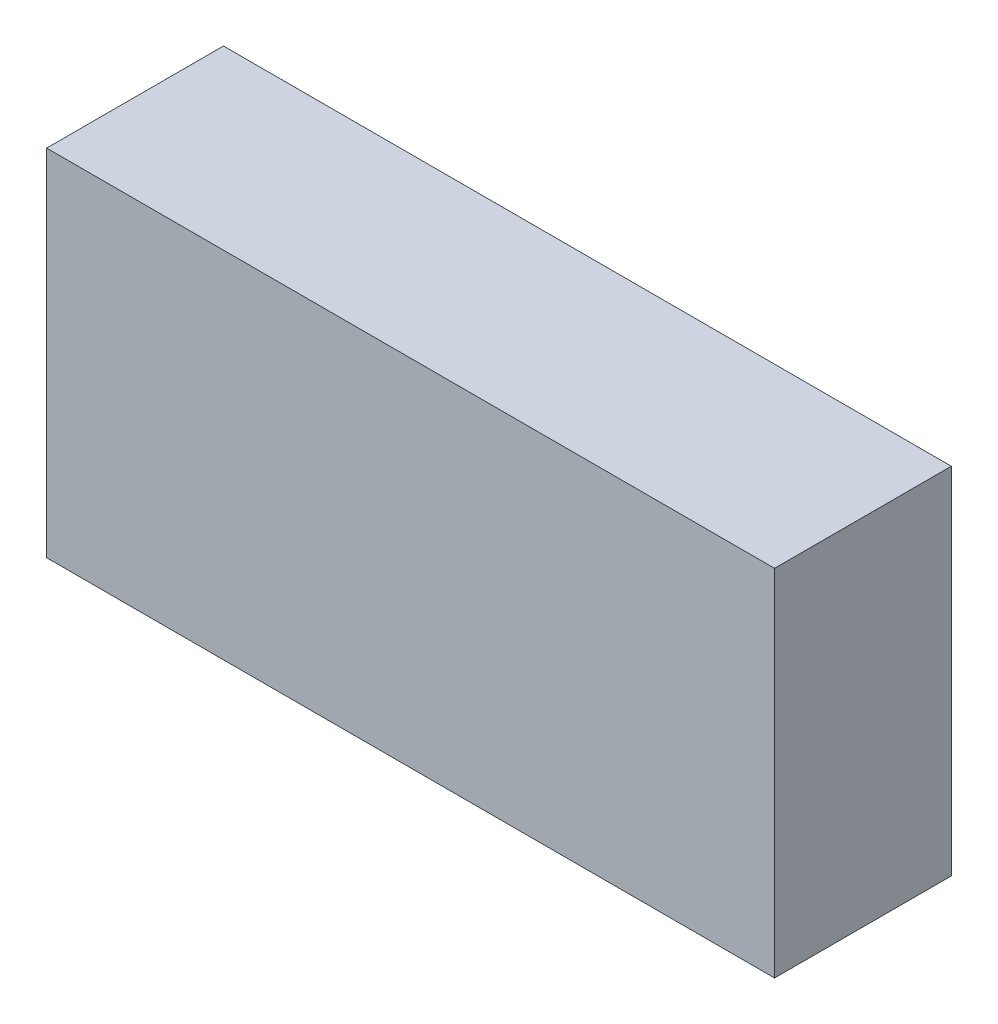
ISO-10303-21;
HEADER;
FILE_DESCRIPTION(('STEP AP214'),'2;1');
FILE_NAME('part.step','',(''),(''),'','','');
FILE_SCHEMA(('AUTOMOTIVE_DESIGN { 1 0 10303 214 1 1 1 1 }'));
ENDSEC;
DATA;
#1=APPLICATION_CONTEXT('core data for automotive mechanical design processes');
#2=APPLICATION_PROTOCOL_DEFINITION('international standard','automotive_design',2000,#1);
#3=PRODUCT_CONTEXT('',#1,'mechanical');
#4=PRODUCT('Part','Part','',(#3));
#5=PRODUCT_RELATED_PRODUCT_CATEGORY('part','',(#4));
#6=PRODUCT_DEFINITION_FORMATION('','',#4);
#7=PRODUCT_DEFINITION_CONTEXT('part definition',#1,'design');
#8=PRODUCT_DEFINITION('design','',#6,#7);
#9=PRODUCT_DEFINITION_SHAPE('','',#8);
#10=(LENGTH_UNIT() NAMED_UNIT(*) SI_UNIT(.MILLI.,.METRE.));
#11=(NAMED_UNIT(*) PLANE_ANGLE_UNIT() SI_UNIT($,.RADIAN.));
#12=(NAMED_UNIT(*) SI_UNIT($,.STERADIAN.) SOLID_ANGLE_UNIT());
#13=UNCERTAINTY_MEASURE_WITH_UNIT(LENGTH_MEASURE(1.E-05),#10,'distance_accuracy_value','');
#14=(GEOMETRIC_REPRESENTATION_CONTEXT(3) GLOBAL_UNCERTAINTY_ASSIGNED_CONTEXT((#13)) GLOBAL_UNIT_ASSIGNED_CONTEXT((#10,
#11,#12)) REPRESENTATION_CONTEXT('',''));
#15=CARTESIAN_POINT('',(0.,0.,0.));
#16=DIRECTION('',(0.,0.,1.));
#17=DIRECTION('',(1.,0.,0.));
#18=AXIS2_PLACEMENT_3D('',#15,#16,#17);
#19=CARTESIAN_POINT('',(0.,37.5158,0.));
#20=DIRECTION('',(-1.,0.,0.));
#21=DIRECTION('',(0.,0.,1.));
#22=AXIS2_PLACEMENT_3D('',#19,#20,#21);
#23=PLANE('',#22);
#24=DIRECTION('',(0.,0.,-1.));
#25=VECTOR('',#24,1.);
#26=CARTESIAN_POINT('',(0.,0.,0.));
#27=LINE('',#26,#25);
#28=CARTESIAN_POINT('',(0.,0.,0.));
#29=VERTEX_POINT('',#28);
#30=CARTESIAN_POINT('',(0.,0.,-18.6944));
#31=VERTEX_POINT('',#30);
#32=EDGE_CURVE('E98',#29,#31,#27,.T.);
#33=ORIENTED_EDGE('',*,*,#32,.T.);
#34=DIRECTION('',(0.,-1.,0.));
#35=VECTOR('',#34,1.);
#36=CARTESIAN_POINT('',(0.,37.5158,-18.6944));
#37=LINE('',#36,#35);
#38=CARTESIAN_POINT('',(0.,37.5158,-18.6944));
#39=VERTEX_POINT('',#38);
#40=EDGE_CURVE('E11',#39,#31,#37,.T.);
#41=ORIENTED_EDGE('',*,*,#40,.F.);
#42=DIRECTION('',(0.,0.,-1.));
#43=VECTOR('',#42,1.);
#44=CARTESIAN_POINT('',(0.,37.5158,0.));
#45=LINE('',#44,#43);
#46=CARTESIAN_POINT('',(0.,37.5158,0.));
#47=VERTEX_POINT('',#46);
#48=EDGE_CURVE('E84',#47,#39,#45,.T.);
#49=ORIENTED_EDGE('',*,*,#48,.F.);
#50=DIRECTION('',(0.,-1.,0.));
#51=VECTOR('',#50,1.);
#52=CARTESIAN_POINT('',(0.,37.5158,0.));
#53=LINE('',#52,#51);
#54=EDGE_CURVE('E51',#47,#29,#53,.T.);
#55=ORIENTED_EDGE('',*,*,#54,.T.);
#56=EDGE_LOOP('',(#33,#41,#49,#55));
#57=FACE_BOUND('',#56,.T.);
#58=ADVANCED_FACE('F35',(#57),#23,.F.);
#59=CARTESIAN_POINT('',(0.,37.5158,-18.6944));
#60=DIRECTION('',(0.,0.,1.));
#61=DIRECTION('',(1.,0.,0.));
#62=AXIS2_PLACEMENT_3D('',#59,#60,#61);
#63=PLANE('',#62);
#64=DIRECTION('',(-1.,0.,0.));
#65=VECTOR('',#64,1.);
#66=CARTESIAN_POINT('',(0.,0.,-18.6944));
#67=LINE('',#66,#65);
#68=CARTESIAN_POINT('',(-76.962,0.,-18.6944));
#69=VERTEX_POINT('',#68);
#70=EDGE_CURVE('E89',#31,#69,#67,.T.);
#71=ORIENTED_EDGE('',*,*,#70,.T.);
#72=DIRECTION('',(0.,-1.,0.));
#73=VECTOR('',#72,1.);
#74=CARTESIAN_POINT('',(-76.962,37.5158,-18.6944));
#75=LINE('',#74,#73);
#76=CARTESIAN_POINT('',(-76.962,37.5158,-18.6944));
#77=VERTEX_POINT('',#76);
#78=EDGE_CURVE('E43',#77,#69,#75,.T.);
#79=ORIENTED_EDGE('',*,*,#78,.F.);
#80=DIRECTION('',(-1.,0.,0.));
#81=VECTOR('',#80,1.);
#82=CARTESIAN_POINT('',(0.,37.5158,-18.6944));
#83=LINE('',#82,#81);
#84=EDGE_CURVE('E76',#39,#77,#83,.T.);
#85=ORIENTED_EDGE('',*,*,#84,.F.);
#86=ORIENTED_EDGE('',*,*,#40,.T.);
#87=EDGE_LOOP('',(#71,#79,#85,#86));
#88=FACE_BOUND('',#87,.T.);
#89=ADVANCED_FACE('F88',(#88),#63,.F.);
#90=CARTESIAN_POINT('',(-76.962,37.5158,0.));
#91=DIRECTION('',(-1.,0.,0.));
#92=DIRECTION('',(0.,0.,1.));
#93=AXIS2_PLACEMENT_3D('',#90,#91,#92);
#94=PLANE('',#93);
#95=DIRECTION('',(0.,0.,-1.));
#96=VECTOR('',#95,1.);
#97=CARTESIAN_POINT('',(-76.962,0.,0.));
#98=LINE('',#97,#96);
#99=CARTESIAN_POINT('',(-76.962,0.,0.));
#100=VERTEX_POINT('',#99);
#101=EDGE_CURVE('E101',#100,#69,#98,.T.);
#102=ORIENTED_EDGE('',*,*,#101,.F.);
#103=DIRECTION('',(0.,-1.,0.));
#104=VECTOR('',#103,1.);
#105=CARTESIAN_POINT('',(-76.962,37.5158,0.));
#106=LINE('',#105,#104);
#107=CARTESIAN_POINT('',(-76.962,37.5158,0.));
#108=VERTEX_POINT('',#107);
#109=EDGE_CURVE('E65',#108,#100,#106,.T.);
#110=ORIENTED_EDGE('',*,*,#109,.F.);
#111=DIRECTION('',(0.,0.,-1.));
#112=VECTOR('',#111,1.);
#113=CARTESIAN_POINT('',(-76.962,37.5158,0.));
#114=LINE('',#113,#112);
#115=EDGE_CURVE('E83',#108,#77,#114,.T.);
#116=ORIENTED_EDGE('',*,*,#115,.T.);
#117=ORIENTED_EDGE('',*,*,#78,.T.);
#118=EDGE_LOOP('',(#102,#110,#116,#117));
#119=FACE_BOUND('',#118,.T.);
#120=ADVANCED_FACE('F92',(#119),#94,.T.);
#121=CARTESIAN_POINT('',(0.,37.5158,0.));
#122=DIRECTION('',(0.,0.,1.));
#123=DIRECTION('',(1.,0.,0.));
#124=AXIS2_PLACEMENT_3D('',#121,#122,#123);
#125=PLANE('',#124);
#126=DIRECTION('',(-1.,0.,0.));
#127=VECTOR('',#126,1.);
#128=CARTESIAN_POINT('',(0.,0.,0.));
#129=LINE('',#128,#127);
#130=EDGE_CURVE('E103',#29,#100,#129,.T.);
#131=ORIENTED_EDGE('',*,*,#130,.F.);
#132=ORIENTED_EDGE('',*,*,#54,.F.);
#133=DIRECTION('',(-1.,0.,0.));
#134=VECTOR('',#133,1.);
#135=CARTESIAN_POINT('',(0.,37.5158,0.));
#136=LINE('',#135,#134);
#137=EDGE_CURVE('E93',#47,#108,#136,.T.);
#138=ORIENTED_EDGE('',*,*,#137,.T.);
#139=ORIENTED_EDGE('',*,*,#109,.T.);
#140=EDGE_LOOP('',(#131,#132,#138,#139));
#141=FACE_BOUND('',#140,.T.);
#142=ADVANCED_FACE('F109',(#141),#125,.T.);
#143=CARTESIAN_POINT('',(0.,37.5158,0.));
#144=DIRECTION('',(0.,1.,0.));
#145=DIRECTION('',(0.,0.,1.));
#146=AXIS2_PLACEMENT_3D('',#143,#144,#145);
#147=PLANE('',#146);
#148=ORIENTED_EDGE('',*,*,#48,.T.);
#149=ORIENTED_EDGE('',*,*,#84,.T.);
#150=ORIENTED_EDGE('',*,*,#115,.F.);
#151=ORIENTED_EDGE('',*,*,#137,.F.);
#152=EDGE_LOOP('',(#148,#149,#150,#151));
#153=FACE_BOUND('',#152,.T.);
#154=ADVANCED_FACE('F80',(#153),#147,.T.);
#155=CARTESIAN_POINT('',(0.,0.,0.));
#156=DIRECTION('',(0.,1.,0.));
#157=DIRECTION('',(0.,0.,1.));
#158=AXIS2_PLACEMENT_3D('',#155,#156,#157);
#159=PLANE('',#158);
#160=ORIENTED_EDGE('',*,*,#32,.F.);
#161=ORIENTED_EDGE('',*,*,#130,.T.);
#162=ORIENTED_EDGE('',*,*,#101,.T.);
#163=ORIENTED_EDGE('',*,*,#70,.F.);
#164=EDGE_LOOP('',(#160,#161,#162,#163));
#165=FACE_BOUND('',#164,.T.);
#166=ADVANCED_FACE('F108',(#165),#159,.F.);
#167=CLOSED_SHELL('',(#58,#89,#120,#142,#154,#166));
#168=MANIFOLD_SOLID_BREP('B2',#167);
#169=ADVANCED_BREP_SHAPE_REPRESENTATION('',(#18,#168),#14);
#170=SHAPE_DEFINITION_REPRESENTATION(#9,#169);
ENDSEC;
END-ISO-10303-21;
